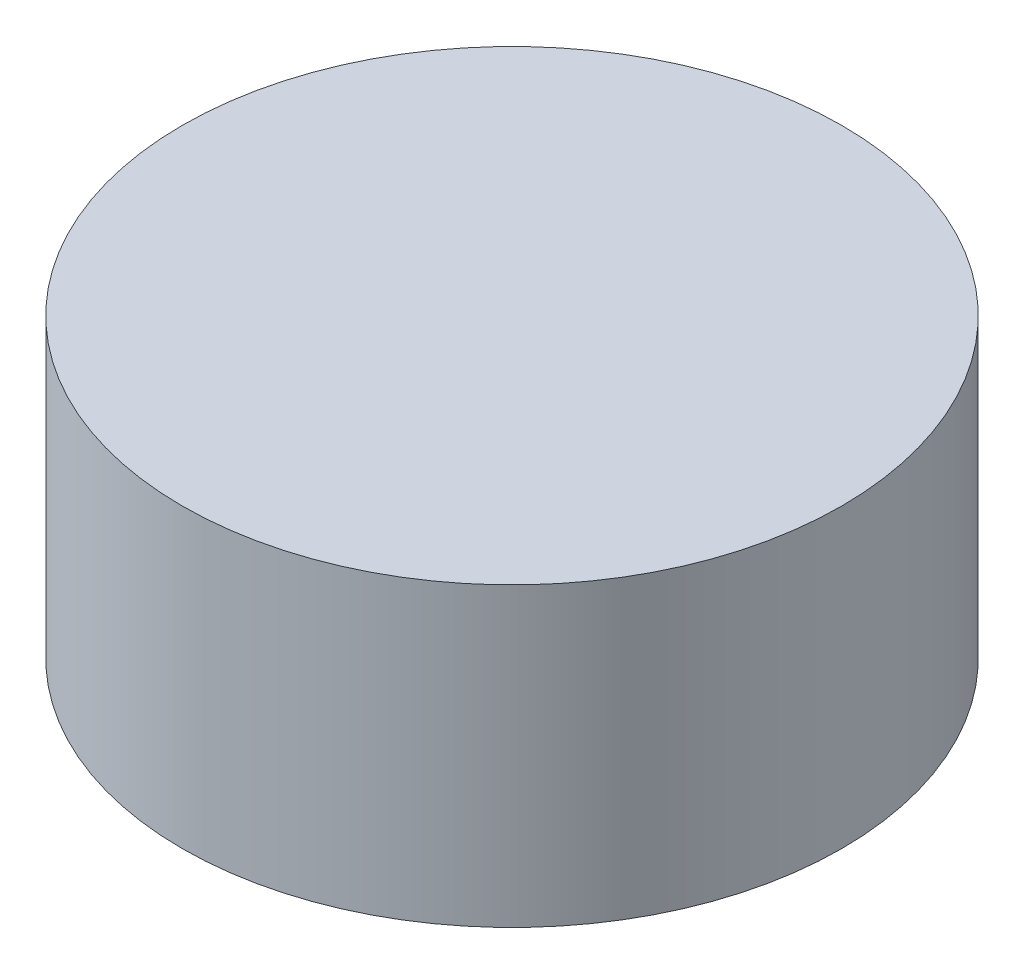
ISO-10303-21;
HEADER;
FILE_DESCRIPTION(('STEP AP214'),'2;1');
FILE_NAME('part.step','',(''),(''),'','','');
FILE_SCHEMA(('AUTOMOTIVE_DESIGN { 1 0 10303 214 1 1 1 1 }'));
ENDSEC;
DATA;
#1=APPLICATION_CONTEXT('core data for automotive mechanical design processes');
#2=APPLICATION_PROTOCOL_DEFINITION('international standard','automotive_design',2000,#1);
#3=PRODUCT_CONTEXT('',#1,'mechanical');
#4=PRODUCT('Part','Part','',(#3));
#5=PRODUCT_RELATED_PRODUCT_CATEGORY('part','',(#4));
#6=PRODUCT_DEFINITION_FORMATION('','',#4);
#7=PRODUCT_DEFINITION_CONTEXT('part definition',#1,'design');
#8=PRODUCT_DEFINITION('design','',#6,#7);
#9=PRODUCT_DEFINITION_SHAPE('','',#8);
#10=(LENGTH_UNIT() NAMED_UNIT(*) SI_UNIT(.MILLI.,.METRE.));
#11=(NAMED_UNIT(*) PLANE_ANGLE_UNIT() SI_UNIT($,.RADIAN.));
#12=(NAMED_UNIT(*) SI_UNIT($,.STERADIAN.) SOLID_ANGLE_UNIT());
#13=UNCERTAINTY_MEASURE_WITH_UNIT(LENGTH_MEASURE(1.E-05),#10,'distance_accuracy_value','');
#14=(GEOMETRIC_REPRESENTATION_CONTEXT(3) GLOBAL_UNCERTAINTY_ASSIGNED_CONTEXT((#13)) GLOBAL_UNIT_ASSIGNED_CONTEXT((#10,
#11,#12)) REPRESENTATION_CONTEXT('',''));
#15=CARTESIAN_POINT('',(0.,0.,0.));
#16=DIRECTION('',(0.,0.,1.));
#17=DIRECTION('',(1.,0.,0.));
#18=AXIS2_PLACEMENT_3D('',#15,#16,#17);
#19=CARTESIAN_POINT('',(0.,2.7,0.));
#20=DIRECTION('',(0.,-1.,0.));
#21=DIRECTION('',(0.,0.,-1.));
#22=AXIS2_PLACEMENT_3D('',#19,#20,#21);
#23=CYLINDRICAL_SURFACE('',#22,3.);
#24=CARTESIAN_POINT('',(0.,2.7,0.));
#25=DIRECTION('',(0.,1.,0.));
#26=DIRECTION('',(0.,0.,1.));
#27=AXIS2_PLACEMENT_3D('',#24,#25,#26);
#28=CIRCLE('',#27,3.);
#29=CARTESIAN_POINT('',(0.,2.7,-3.));
#30=VERTEX_POINT('',#29);
#31=EDGE_CURVE('E10',#30,#30,#28,.T.);
#32=CARTESIAN_POINT('',(0.,0.,0.));
#33=DIRECTION('',(0.,1.,0.));
#34=DIRECTION('',(0.,0.,1.));
#35=AXIS2_PLACEMENT_3D('',#32,#33,#34);
#36=CIRCLE('',#35,3.);
#37=CARTESIAN_POINT('',(0.,0.,-3.));
#38=VERTEX_POINT('',#37);
#39=EDGE_CURVE('E34',#38,#38,#36,.T.);
#40=CARTESIAN_POINT('',(0.,2.7,-3.));
#41=CARTESIAN_POINT('',(0.,2.671875,-3.));
#42=CARTESIAN_POINT('',(0.,2.64375,-3.));
#43=CARTESIAN_POINT('',(0.,2.5875,-3.));
#44=CARTESIAN_POINT('',(0.,2.559375,-3.));
#45=CARTESIAN_POINT('',(0.,2.503125,-3.));
#46=CARTESIAN_POINT('',(0.,2.475,-3.));
#47=CARTESIAN_POINT('',(0.,2.41875,-3.));
#48=CARTESIAN_POINT('',(0.,2.390625,-3.));
#49=CARTESIAN_POINT('',(0.,2.334375,-3.));
#50=CARTESIAN_POINT('',(0.,2.30625,-3.));
#51=CARTESIAN_POINT('',(0.,2.25,-3.));
#52=CARTESIAN_POINT('',(0.,2.221875,-3.));
#53=CARTESIAN_POINT('',(0.,2.165625,-3.));
#54=CARTESIAN_POINT('',(0.,2.1375,-3.));
#55=CARTESIAN_POINT('',(0.,2.08125,-3.));
#56=CARTESIAN_POINT('',(0.,2.053125,-3.));
#57=CARTESIAN_POINT('',(0.,1.996875,-3.));
#58=CARTESIAN_POINT('',(0.,1.96875,-3.));
#59=CARTESIAN_POINT('',(0.,1.9125,-3.));
#60=CARTESIAN_POINT('',(0.,1.884375,-3.));
#61=CARTESIAN_POINT('',(0.,1.828125,-3.));
#62=CARTESIAN_POINT('',(0.,1.8,-3.));
#63=CARTESIAN_POINT('',(0.,1.74375,-3.));
#64=CARTESIAN_POINT('',(0.,1.715625,-3.));
#65=CARTESIAN_POINT('',(0.,1.659375,-3.));
#66=CARTESIAN_POINT('',(0.,1.63125,-3.));
#67=CARTESIAN_POINT('',(0.,1.575,-3.));
#68=CARTESIAN_POINT('',(0.,1.546875,-3.));
#69=CARTESIAN_POINT('',(0.,1.490625,-3.));
#70=CARTESIAN_POINT('',(0.,1.4625,-3.));
#71=CARTESIAN_POINT('',(0.,1.40625,-3.));
#72=CARTESIAN_POINT('',(0.,1.378125,-3.));
#73=CARTESIAN_POINT('',(0.,1.321875,-3.));
#74=CARTESIAN_POINT('',(0.,1.29375,-3.));
#75=CARTESIAN_POINT('',(0.,1.2375,-3.));
#76=CARTESIAN_POINT('',(0.,1.209375,-3.));
#77=CARTESIAN_POINT('',(0.,1.153125,-3.));
#78=CARTESIAN_POINT('',(0.,1.125,-3.));
#79=CARTESIAN_POINT('',(0.,1.06875,-3.));
#80=CARTESIAN_POINT('',(0.,1.040625,-3.));
#81=CARTESIAN_POINT('',(0.,0.984375,-3.));
#82=CARTESIAN_POINT('',(0.,0.95625,-3.));
#83=CARTESIAN_POINT('',(0.,0.9,-3.));
#84=CARTESIAN_POINT('',(0.,0.871875,-3.));
#85=CARTESIAN_POINT('',(0.,0.815625,-3.));
#86=CARTESIAN_POINT('',(0.,0.7875,-3.));
#87=CARTESIAN_POINT('',(0.,0.73125,-3.));
#88=CARTESIAN_POINT('',(0.,0.703125,-3.));
#89=CARTESIAN_POINT('',(0.,0.646875,-3.));
#90=CARTESIAN_POINT('',(0.,0.61875,-3.));
#91=CARTESIAN_POINT('',(0.,0.5625,-3.));
#92=CARTESIAN_POINT('',(0.,0.534375,-3.));
#93=CARTESIAN_POINT('',(0.,0.478125,-3.));
#94=CARTESIAN_POINT('',(0.,0.45,-3.));
#95=CARTESIAN_POINT('',(0.,0.39375,-3.));
#96=CARTESIAN_POINT('',(0.,0.365625,-3.));
#97=CARTESIAN_POINT('',(0.,0.309375,-3.));
#98=CARTESIAN_POINT('',(0.,0.28125,-3.));
#99=CARTESIAN_POINT('',(0.,0.225,-3.));
#100=CARTESIAN_POINT('',(0.,0.196875,-3.));
#101=CARTESIAN_POINT('',(0.,0.140625,-3.));
#102=CARTESIAN_POINT('',(0.,0.112499999999999,-3.));
#103=CARTESIAN_POINT('',(0.,0.0562499999999994,-3.));
#104=CARTESIAN_POINT('',(0.,0.0281249999999995,-3.));
#105=CARTESIAN_POINT('',(0.,0.,-3.));
#106=B_SPLINE_CURVE_WITH_KNOTS('',3,(#40,#41,#42,#43,#44,#45,#46,#47,#48,#49,#50,#51,#52,#53,
#54,#55,#56,#57,#58,#59,#60,#61,#62,#63,#64,#65,#66,#67,#68,#69,#70,#71,#72,#73,#74,#75,#76,#77,
#78,#79,#80,#81,#82,#83,#84,#85,#86,#87,#88,#89,#90,#91,#92,#93,#94,#95,#96,#97,#98,#99,#100,
#101,#102,#103,#104,#105),.UNSPECIFIED.,.F.,.F.,(4,2,2,2,2,2,2,2,2,2,2,2,2,2,2,2,2,2,2,2,2,2,2,
2,2,2,2,2,2,2,2,2,4),(0.,0.0843749999999998,0.16875,0.253125,0.3375,0.421875,0.50625,0.590625,
0.675,0.759375,0.84375,0.928125,1.0125,1.096875,1.18125,1.265625,1.35,1.434375,1.51875,1.603125,
1.6875,1.771875,1.85625,1.940625,2.025,2.109375,2.19375,2.278125,2.3625,2.446875,2.53125,
2.615625,2.7),.UNSPECIFIED.);
#107=EDGE_CURVE('BSEAM31',#30,#38,#106,.T.);
#108=ORIENTED_EDGE('',*,*,#31,.F.);
#109=ORIENTED_EDGE('',*,*,#39,.T.);
#110=ORIENTED_EDGE('',*,*,#107,.T.);
#111=ORIENTED_EDGE('',*,*,#107,.F.);
#112=EDGE_LOOP('',(#108,#110,#109,#111));
#113=FACE_BOUND('',#112,.T.);
#114=ADVANCED_FACE('F31',(#113),#23,.T.);
#115=CARTESIAN_POINT('',(0.,2.7,0.));
#116=DIRECTION('',(0.,1.,0.));
#117=DIRECTION('',(0.,0.,1.));
#118=AXIS2_PLACEMENT_3D('',#115,#116,#117);
#119=PLANE('',#118);
#120=ORIENTED_EDGE('',*,*,#31,.T.);
#121=EDGE_LOOP('',(#120));
#122=FACE_BOUND('',#121,.T.);
#123=ADVANCED_FACE('F46',(#122),#119,.T.);
#124=CARTESIAN_POINT('',(0.,0.,0.));
#125=DIRECTION('',(0.,1.,0.));
#126=DIRECTION('',(0.,0.,1.));
#127=AXIS2_PLACEMENT_3D('',#124,#125,#126);
#128=PLANE('',#127);
#129=ORIENTED_EDGE('',*,*,#39,.F.);
#130=EDGE_LOOP('',(#129));
#131=FACE_BOUND('',#130,.T.);
#132=ADVANCED_FACE('F44',(#131),#128,.F.);
#133=CLOSED_SHELL('',(#114,#123,#132));
#134=MANIFOLD_SOLID_BREP('B2',#133);
#135=ADVANCED_BREP_SHAPE_REPRESENTATION('',(#18,#134),#14);
#136=SHAPE_DEFINITION_REPRESENTATION(#9,#135);
ENDSEC;
END-ISO-10303-21;
